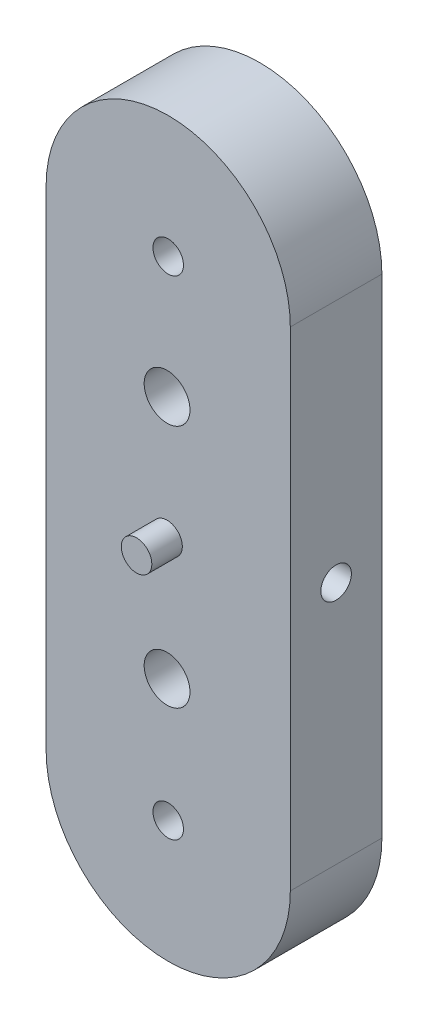
ISO-10303-21;
HEADER;
FILE_DESCRIPTION(('STEP AP214'),'2;1');
FILE_NAME('part.step','',(''),(''),'','','');
FILE_SCHEMA(('AUTOMOTIVE_DESIGN { 1 0 10303 214 1 1 1 1 }'));
ENDSEC;
DATA;
#1=APPLICATION_CONTEXT('core data for automotive mechanical design processes');
#2=APPLICATION_PROTOCOL_DEFINITION('international standard','automotive_design',2000,#1);
#3=PRODUCT_CONTEXT('',#1,'mechanical');
#4=PRODUCT('Part','Part','',(#3));
#5=PRODUCT_RELATED_PRODUCT_CATEGORY('part','',(#4));
#6=PRODUCT_DEFINITION_FORMATION('','',#4);
#7=PRODUCT_DEFINITION_CONTEXT('part definition',#1,'design');
#8=PRODUCT_DEFINITION('design','',#6,#7);
#9=PRODUCT_DEFINITION_SHAPE('','',#8);
#10=(LENGTH_UNIT() NAMED_UNIT(*) SI_UNIT(.MILLI.,.METRE.));
#11=(NAMED_UNIT(*) PLANE_ANGLE_UNIT() SI_UNIT($,.RADIAN.));
#12=(NAMED_UNIT(*) SI_UNIT($,.STERADIAN.) SOLID_ANGLE_UNIT());
#13=UNCERTAINTY_MEASURE_WITH_UNIT(LENGTH_MEASURE(1.E-05),#10,'distance_accuracy_value','');
#14=(GEOMETRIC_REPRESENTATION_CONTEXT(3) GLOBAL_UNCERTAINTY_ASSIGNED_CONTEXT((#13)) GLOBAL_UNIT_ASSIGNED_CONTEXT((#10,
#11,#12)) REPRESENTATION_CONTEXT('',''));
#15=CARTESIAN_POINT('',(0.,0.,0.));
#16=DIRECTION('',(0.,0.,1.));
#17=DIRECTION('',(1.,0.,0.));
#18=AXIS2_PLACEMENT_3D('',#15,#16,#17);
#19=CARTESIAN_POINT('',(50.8,0.,38.1));
#20=DIRECTION('',(0.,0.,-1.));
#21=DIRECTION('',(-1.,0.,0.));
#22=AXIS2_PLACEMENT_3D('',#19,#20,#21);
#23=CYLINDRICAL_SURFACE('',#22,50.8);
#24=CARTESIAN_POINT('',(50.8,0.,0.));
#25=DIRECTION('',(0.,0.,1.));
#26=DIRECTION('',(1.,0.,0.));
#27=AXIS2_PLACEMENT_3D('',#24,#25,#26);
#28=CIRCLE('',#27,50.8);
#29=CARTESIAN_POINT('',(0.,0.,0.));
#30=VERTEX_POINT('',#29);
#31=CARTESIAN_POINT('',(101.6,0.,0.));
#32=VERTEX_POINT('',#31);
#33=EDGE_CURVE('E113',#30,#32,#28,.T.);
#34=ORIENTED_EDGE('',*,*,#33,.T.);
#35=DIRECTION('',(0.,0.,-1.));
#36=VECTOR('',#35,1.);
#37=CARTESIAN_POINT('',(101.6,0.,38.1));
#38=LINE('',#37,#36);
#39=CARTESIAN_POINT('',(101.6,0.,38.1));
#40=VERTEX_POINT('',#39);
#41=EDGE_CURVE('E12',#40,#32,#38,.T.);
#42=ORIENTED_EDGE('',*,*,#41,.F.);
#43=CARTESIAN_POINT('',(50.8,0.,38.1));
#44=DIRECTION('',(0.,0.,1.));
#45=DIRECTION('',(1.,0.,0.));
#46=AXIS2_PLACEMENT_3D('',#43,#44,#45);
#47=CIRCLE('',#46,50.8);
#48=CARTESIAN_POINT('',(0.,0.,38.1));
#49=VERTEX_POINT('',#48);
#50=EDGE_CURVE('E97',#49,#40,#47,.T.);
#51=ORIENTED_EDGE('',*,*,#50,.F.);
#52=DIRECTION('',(0.,0.,-1.));
#53=VECTOR('',#52,1.);
#54=CARTESIAN_POINT('',(0.,0.,38.1));
#55=LINE('',#54,#53);
#56=EDGE_CURVE('E109',#49,#30,#55,.T.);
#57=ORIENTED_EDGE('',*,*,#56,.T.);
#58=EDGE_LOOP('',(#34,#42,#51,#57));
#59=FACE_BOUND('',#58,.T.);
#60=ADVANCED_FACE('F45',(#59),#23,.T.);
#61=CARTESIAN_POINT('',(101.6,203.2,38.1));
#62=DIRECTION('',(-1.,0.,0.));
#63=DIRECTION('',(0.,0.,1.));
#64=AXIS2_PLACEMENT_3D('',#61,#62,#63);
#65=PLANE('',#64);
#66=CARTESIAN_POINT('',(101.6,101.6,19.05));
#67=DIRECTION('',(1.,0.,0.));
#68=DIRECTION('',(0.,0.,-1.));
#69=AXIS2_PLACEMENT_3D('',#66,#67,#68);
#70=CIRCLE('',#69,6.35);
#71=CARTESIAN_POINT('',(101.6,101.6,12.7));
#72=VERTEX_POINT('',#71);
#73=EDGE_CURVE('E174',#72,#72,#70,.T.);
#74=ORIENTED_EDGE('',*,*,#73,.F.);
#75=EDGE_LOOP('',(#74));
#76=FACE_BOUND('',#75,.T.);
#77=DIRECTION('',(0.,1.,0.));
#78=VECTOR('',#77,1.);
#79=CARTESIAN_POINT('',(101.6,203.2,0.));
#80=LINE('',#79,#78);
#81=CARTESIAN_POINT('',(101.6,203.2,0.));
#82=VERTEX_POINT('',#81);
#83=EDGE_CURVE('E102',#32,#82,#80,.T.);
#84=ORIENTED_EDGE('',*,*,#83,.T.);
#85=DIRECTION('',(0.,0.,-1.));
#86=VECTOR('',#85,1.);
#87=CARTESIAN_POINT('',(101.6,203.2,38.1));
#88=LINE('',#87,#86);
#89=CARTESIAN_POINT('',(101.6,203.2,38.1));
#90=VERTEX_POINT('',#89);
#91=EDGE_CURVE('E54',#90,#82,#88,.T.);
#92=ORIENTED_EDGE('',*,*,#91,.F.);
#93=DIRECTION('',(0.,1.,0.));
#94=VECTOR('',#93,1.);
#95=CARTESIAN_POINT('',(101.6,203.2,38.1));
#96=LINE('',#95,#94);
#97=EDGE_CURVE('E92',#40,#90,#96,.T.);
#98=ORIENTED_EDGE('',*,*,#97,.F.);
#99=ORIENTED_EDGE('',*,*,#41,.T.);
#100=EDGE_LOOP('',(#84,#92,#98,#99));
#101=FACE_BOUND('',#100,.T.);
#102=ADVANCED_FACE('F101',(#76,#101),#65,.F.);
#103=CARTESIAN_POINT('',(50.8,203.2,38.1));
#104=DIRECTION('',(0.,0.,-1.));
#105=DIRECTION('',(-1.,0.,0.));
#106=AXIS2_PLACEMENT_3D('',#103,#104,#105);
#107=CYLINDRICAL_SURFACE('',#106,50.8);
#108=CARTESIAN_POINT('',(50.8,203.2,0.));
#109=DIRECTION('',(0.,0.,1.));
#110=DIRECTION('',(-1.,0.,0.));
#111=AXIS2_PLACEMENT_3D('',#108,#109,#110);
#112=CIRCLE('',#111,50.8);
#113=CARTESIAN_POINT('',(0.,203.2,0.));
#114=VERTEX_POINT('',#113);
#115=EDGE_CURVE('E79',#82,#114,#112,.T.);
#116=ORIENTED_EDGE('',*,*,#115,.T.);
#117=DIRECTION('',(0.,0.,-1.));
#118=VECTOR('',#117,1.);
#119=CARTESIAN_POINT('',(0.,203.2,38.1));
#120=LINE('',#119,#118);
#121=CARTESIAN_POINT('',(0.,203.2,38.1));
#122=VERTEX_POINT('',#121);
#123=EDGE_CURVE('E104',#122,#114,#120,.T.);
#124=ORIENTED_EDGE('',*,*,#123,.F.);
#125=CARTESIAN_POINT('',(50.8,203.2,38.1));
#126=DIRECTION('',(0.,0.,1.));
#127=DIRECTION('',(-1.,0.,0.));
#128=AXIS2_PLACEMENT_3D('',#125,#126,#127);
#129=CIRCLE('',#128,50.8);
#130=EDGE_CURVE('E95',#90,#122,#129,.T.);
#131=ORIENTED_EDGE('',*,*,#130,.F.);
#132=ORIENTED_EDGE('',*,*,#91,.T.);
#133=EDGE_LOOP('',(#116,#124,#131,#132));
#134=FACE_BOUND('',#133,.T.);
#135=ADVANCED_FACE('F105',(#134),#107,.T.);
#136=CARTESIAN_POINT('',(0.,0.,38.1));
#137=DIRECTION('',(1.,0.,0.));
#138=DIRECTION('',(0.,1.,0.));
#139=AXIS2_PLACEMENT_3D('',#136,#137,#138);
#140=PLANE('',#139);
#141=CARTESIAN_POINT('',(0.,101.6,19.05));
#142=DIRECTION('',(1.,0.,0.));
#143=DIRECTION('',(0.,0.,-1.));
#144=AXIS2_PLACEMENT_3D('',#141,#142,#143);
#145=CIRCLE('',#144,6.35);
#146=CARTESIAN_POINT('',(0.,101.6,12.7));
#147=VERTEX_POINT('',#146);
#148=EDGE_CURVE('E170',#147,#147,#145,.T.);
#149=ORIENTED_EDGE('',*,*,#148,.T.);
#150=EDGE_LOOP('',(#149));
#151=FACE_BOUND('',#150,.T.);
#152=DIRECTION('',(0.,-1.,0.));
#153=VECTOR('',#152,1.);
#154=CARTESIAN_POINT('',(0.,0.,0.));
#155=LINE('',#154,#153);
#156=EDGE_CURVE('E85',#114,#30,#155,.T.);
#157=ORIENTED_EDGE('',*,*,#156,.T.);
#158=ORIENTED_EDGE('',*,*,#56,.F.);
#159=DIRECTION('',(0.,-1.,0.));
#160=VECTOR('',#159,1.);
#161=CARTESIAN_POINT('',(0.,0.,38.1));
#162=LINE('',#161,#160);
#163=EDGE_CURVE('E62',#122,#49,#162,.T.);
#164=ORIENTED_EDGE('',*,*,#163,.F.);
#165=ORIENTED_EDGE('',*,*,#123,.T.);
#166=EDGE_LOOP('',(#157,#158,#164,#165));
#167=FACE_BOUND('',#166,.T.);
#168=ADVANCED_FACE('F127',(#151,#167),#140,.F.);
#169=CARTESIAN_POINT('',(50.8,0.,38.1));
#170=DIRECTION('',(0.,0.,1.));
#171=DIRECTION('',(1.,0.,0.));
#172=AXIS2_PLACEMENT_3D('',#169,#170,#171);
#173=PLANE('',#172);
#174=CARTESIAN_POINT('',(50.3278473783734,101.6,38.1));
#175=DIRECTION('',(0.,0.,1.));
#176=DIRECTION('',(1.,0.,0.));
#177=AXIS2_PLACEMENT_3D('',#174,#175,#176);
#178=CIRCLE('',#177,6.35);
#179=CARTESIAN_POINT('',(56.6778473783734,101.6,38.1));
#180=VERTEX_POINT('',#179);
#181=EDGE_CURVE('E166',#180,#180,#178,.T.);
#182=ORIENTED_EDGE('',*,*,#181,.F.);
#183=EDGE_LOOP('',(#182));
#184=FACE_BOUND('',#183,.T.);
#185=CARTESIAN_POINT('',(50.3278473783734,152.4,38.1));
#186=DIRECTION('',(0.,0.,1.));
#187=DIRECTION('',(1.,0.,0.));
#188=AXIS2_PLACEMENT_3D('',#185,#186,#187);
#189=CIRCLE('',#188,9.52499999999999);
#190=CARTESIAN_POINT('',(59.8528473783733,152.4,38.1));
#191=VERTEX_POINT('',#190);
#192=EDGE_CURVE('E154',#191,#191,#189,.T.);
#193=ORIENTED_EDGE('',*,*,#192,.F.);
#194=EDGE_LOOP('',(#193));
#195=FACE_BOUND('',#194,.T.);
#196=CARTESIAN_POINT('',(50.3278473783734,50.8,38.1));
#197=DIRECTION('',(0.,0.,1.));
#198=DIRECTION('',(1.,0.,0.));
#199=AXIS2_PLACEMENT_3D('',#196,#197,#198);
#200=CIRCLE('',#199,9.52499999999999);
#201=CARTESIAN_POINT('',(59.8528473783733,50.8,38.1));
#202=VERTEX_POINT('',#201);
#203=EDGE_CURVE('E150',#202,#202,#200,.T.);
#204=ORIENTED_EDGE('',*,*,#203,.F.);
#205=EDGE_LOOP('',(#204));
#206=FACE_BOUND('',#205,.T.);
#207=CARTESIAN_POINT('',(50.8,0.,38.1));
#208=DIRECTION('',(0.,0.,1.));
#209=DIRECTION('',(1.,0.,0.));
#210=AXIS2_PLACEMENT_3D('',#207,#208,#209);
#211=CIRCLE('',#210,6.35);
#212=CARTESIAN_POINT('',(57.15,0.,38.1));
#213=VERTEX_POINT('',#212);
#214=EDGE_CURVE('E143',#213,#213,#211,.T.);
#215=ORIENTED_EDGE('',*,*,#214,.F.);
#216=EDGE_LOOP('',(#215));
#217=FACE_BOUND('',#216,.T.);
#218=CARTESIAN_POINT('',(50.8,203.2,38.1));
#219=DIRECTION('',(0.,0.,1.));
#220=DIRECTION('',(1.,0.,0.));
#221=AXIS2_PLACEMENT_3D('',#218,#219,#220);
#222=CIRCLE('',#221,6.35);
#223=CARTESIAN_POINT('',(57.15,203.2,38.1));
#224=VERTEX_POINT('',#223);
#225=EDGE_CURVE('E138',#224,#224,#222,.T.);
#226=ORIENTED_EDGE('',*,*,#225,.F.);
#227=EDGE_LOOP('',(#226));
#228=FACE_BOUND('',#227,.T.);
#229=ORIENTED_EDGE('',*,*,#50,.T.);
#230=ORIENTED_EDGE('',*,*,#97,.T.);
#231=ORIENTED_EDGE('',*,*,#130,.T.);
#232=ORIENTED_EDGE('',*,*,#163,.T.);
#233=EDGE_LOOP('',(#229,#230,#231,#232));
#234=FACE_BOUND('',#233,.T.);
#235=ADVANCED_FACE('F93',(#184,#195,#206,#217,#228,#234),#173,.T.);
#236=CARTESIAN_POINT('',(50.8,0.,0.));
#237=DIRECTION('',(0.,0.,1.));
#238=DIRECTION('',(1.,0.,0.));
#239=AXIS2_PLACEMENT_3D('',#236,#237,#238);
#240=PLANE('',#239);
#241=CARTESIAN_POINT('',(50.8,0.,0.));
#242=DIRECTION('',(0.,0.,1.));
#243=DIRECTION('',(1.,0.,0.));
#244=AXIS2_PLACEMENT_3D('',#241,#242,#243);
#245=CIRCLE('',#244,6.35);
#246=CARTESIAN_POINT('',(57.15,0.,0.));
#247=VERTEX_POINT('',#246);
#248=EDGE_CURVE('E117',#247,#247,#245,.T.);
#249=ORIENTED_EDGE('',*,*,#248,.T.);
#250=EDGE_LOOP('',(#249));
#251=FACE_BOUND('',#250,.T.);
#252=CARTESIAN_POINT('',(50.8,203.2,0.));
#253=DIRECTION('',(0.,0.,1.));
#254=DIRECTION('',(1.,0.,0.));
#255=AXIS2_PLACEMENT_3D('',#252,#253,#254);
#256=CIRCLE('',#255,6.35);
#257=CARTESIAN_POINT('',(57.15,203.2,0.));
#258=VERTEX_POINT('',#257);
#259=EDGE_CURVE('E134',#258,#258,#256,.T.);
#260=ORIENTED_EDGE('',*,*,#259,.T.);
#261=EDGE_LOOP('',(#260));
#262=FACE_BOUND('',#261,.T.);
#263=ORIENTED_EDGE('',*,*,#33,.F.);
#264=ORIENTED_EDGE('',*,*,#156,.F.);
#265=ORIENTED_EDGE('',*,*,#115,.F.);
#266=ORIENTED_EDGE('',*,*,#83,.F.);
#267=EDGE_LOOP('',(#263,#264,#265,#266));
#268=FACE_BOUND('',#267,.T.);
#269=ADVANCED_FACE('F130',(#251,#262,#268),#240,.F.);
#270=CARTESIAN_POINT('',(50.8,203.2,0.));
#271=DIRECTION('',(0.,0.,1.));
#272=DIRECTION('',(1.,0.,0.));
#273=AXIS2_PLACEMENT_3D('',#270,#271,#272);
#274=CYLINDRICAL_SURFACE('',#273,6.35);
#275=CARTESIAN_POINT('',(57.15,203.2,0.));
#276=CARTESIAN_POINT('',(57.15,203.2,0.396875));
#277=CARTESIAN_POINT('',(57.15,203.2,0.79375));
#278=CARTESIAN_POINT('',(57.15,203.2,1.5875));
#279=CARTESIAN_POINT('',(57.15,203.2,1.984375));
#280=CARTESIAN_POINT('',(57.15,203.2,2.778125));
#281=CARTESIAN_POINT('',(57.15,203.2,3.175));
#282=CARTESIAN_POINT('',(57.15,203.2,3.96875));
#283=CARTESIAN_POINT('',(57.15,203.2,4.365625));
#284=CARTESIAN_POINT('',(57.15,203.2,5.159375));
#285=CARTESIAN_POINT('',(57.15,203.2,5.55625));
#286=CARTESIAN_POINT('',(57.15,203.2,6.35));
#287=CARTESIAN_POINT('',(57.15,203.2,6.746875));
#288=CARTESIAN_POINT('',(57.15,203.2,7.540625));
#289=CARTESIAN_POINT('',(57.15,203.2,7.9375));
#290=CARTESIAN_POINT('',(57.15,203.2,8.73125));
#291=CARTESIAN_POINT('',(57.15,203.2,9.128125));
#292=CARTESIAN_POINT('',(57.15,203.2,9.921875));
#293=CARTESIAN_POINT('',(57.15,203.2,10.31875));
#294=CARTESIAN_POINT('',(57.15,203.2,11.1125));
#295=CARTESIAN_POINT('',(57.15,203.2,11.509375));
#296=CARTESIAN_POINT('',(57.15,203.2,12.303125));
#297=CARTESIAN_POINT('',(57.15,203.2,12.7));
#298=CARTESIAN_POINT('',(57.15,203.2,13.49375));
#299=CARTESIAN_POINT('',(57.15,203.2,13.890625));
#300=CARTESIAN_POINT('',(57.15,203.2,14.684375));
#301=CARTESIAN_POINT('',(57.15,203.2,15.08125));
#302=CARTESIAN_POINT('',(57.15,203.2,15.875));
#303=CARTESIAN_POINT('',(57.15,203.2,16.271875));
#304=CARTESIAN_POINT('',(57.15,203.2,17.065625));
#305=CARTESIAN_POINT('',(57.15,203.2,17.4625));
#306=CARTESIAN_POINT('',(57.15,203.2,18.25625));
#307=CARTESIAN_POINT('',(57.15,203.2,18.653125));
#308=CARTESIAN_POINT('',(57.15,203.2,19.446875));
#309=CARTESIAN_POINT('',(57.15,203.2,19.84375));
#310=CARTESIAN_POINT('',(57.15,203.2,20.6375));
#311=CARTESIAN_POINT('',(57.15,203.2,21.034375));
#312=CARTESIAN_POINT('',(57.15,203.2,21.828125));
#313=CARTESIAN_POINT('',(57.15,203.2,22.225));
#314=CARTESIAN_POINT('',(57.15,203.2,23.01875));
#315=CARTESIAN_POINT('',(57.15,203.2,23.415625));
#316=CARTESIAN_POINT('',(57.15,203.2,24.209375));
#317=CARTESIAN_POINT('',(57.15,203.2,24.60625));
#318=CARTESIAN_POINT('',(57.15,203.2,25.4));
#319=CARTESIAN_POINT('',(57.15,203.2,25.796875));
#320=CARTESIAN_POINT('',(57.15,203.2,26.590625));
#321=CARTESIAN_POINT('',(57.15,203.2,26.9875));
#322=CARTESIAN_POINT('',(57.15,203.2,27.78125));
#323=CARTESIAN_POINT('',(57.15,203.2,28.178125));
#324=CARTESIAN_POINT('',(57.15,203.2,28.971875));
#325=CARTESIAN_POINT('',(57.15,203.2,29.36875));
#326=CARTESIAN_POINT('',(57.15,203.2,30.1625));
#327=CARTESIAN_POINT('',(57.15,203.2,30.559375));
#328=CARTESIAN_POINT('',(57.15,203.2,31.353125));
#329=CARTESIAN_POINT('',(57.15,203.2,31.75));
#330=CARTESIAN_POINT('',(57.15,203.2,32.54375));
#331=CARTESIAN_POINT('',(57.15,203.2,32.940625));
#332=CARTESIAN_POINT('',(57.15,203.2,33.734375));
#333=CARTESIAN_POINT('',(57.15,203.2,34.13125));
#334=CARTESIAN_POINT('',(57.15,203.2,34.925));
#335=CARTESIAN_POINT('',(57.15,203.2,35.321875));
#336=CARTESIAN_POINT('',(57.15,203.2,36.115625));
#337=CARTESIAN_POINT('',(57.15,203.2,36.5125));
#338=CARTESIAN_POINT('',(57.15,203.2,37.30625));
#339=CARTESIAN_POINT('',(57.15,203.2,37.703125));
#340=CARTESIAN_POINT('',(57.15,203.2,38.1));
#341=B_SPLINE_CURVE_WITH_KNOTS('',3,(#275,#276,#277,#278,#279,#280,#281,#282,#283,#284,#285,
#286,#287,#288,#289,#290,#291,#292,#293,#294,#295,#296,#297,#298,#299,#300,#301,#302,#303,#304,
#305,#306,#307,#308,#309,#310,#311,#312,#313,#314,#315,#316,#317,#318,#319,#320,#321,#322,#323,
#324,#325,#326,#327,#328,#329,#330,#331,#332,#333,#334,#335,#336,#337,#338,#339,#340),
.UNSPECIFIED.,.F.,.F.,(4,2,2,2,2,2,2,2,2,2,2,2,2,2,2,2,2,2,2,2,2,2,2,2,2,2,2,2,2,2,2,2,4),(0.,
1.190625,2.38125,3.571875,4.7625,5.953125,7.14375,8.334375,9.525,10.715625,11.90625,13.096875,
14.2875,15.478125,16.66875,17.859375,19.05,20.240625,21.43125,22.621875,23.8125,25.003125,
26.19375,27.384375,28.575,29.765625,30.95625,32.146875,33.3375,34.528125,35.71875,36.909375,
38.1),.UNSPECIFIED.);
#342=EDGE_CURVE('BSEAM201',#258,#224,#341,.T.);
#343=ORIENTED_EDGE('',*,*,#259,.F.);
#344=ORIENTED_EDGE('',*,*,#225,.T.);
#345=ORIENTED_EDGE('',*,*,#342,.T.);
#346=ORIENTED_EDGE('',*,*,#342,.F.);
#347=EDGE_LOOP('',(#343,#345,#344,#346));
#348=FACE_BOUND('',#347,.T.);
#349=ADVANCED_FACE('F201',(#348),#274,.F.);
#350=CARTESIAN_POINT('',(50.8,0.,0.));
#351=DIRECTION('',(0.,0.,1.));
#352=DIRECTION('',(1.,0.,0.));
#353=AXIS2_PLACEMENT_3D('',#350,#351,#352);
#354=CYLINDRICAL_SURFACE('',#353,6.35);
#355=CARTESIAN_POINT('',(57.15,0.,0.));
#356=CARTESIAN_POINT('',(57.15,0.,0.396875));
#357=CARTESIAN_POINT('',(57.15,0.,0.79375));
#358=CARTESIAN_POINT('',(57.15,0.,1.5875));
#359=CARTESIAN_POINT('',(57.15,0.,1.984375));
#360=CARTESIAN_POINT('',(57.15,0.,2.778125));
#361=CARTESIAN_POINT('',(57.15,0.,3.175));
#362=CARTESIAN_POINT('',(57.15,0.,3.96875));
#363=CARTESIAN_POINT('',(57.15,0.,4.365625));
#364=CARTESIAN_POINT('',(57.15,0.,5.159375));
#365=CARTESIAN_POINT('',(57.15,0.,5.55625));
#366=CARTESIAN_POINT('',(57.15,0.,6.35));
#367=CARTESIAN_POINT('',(57.15,0.,6.746875));
#368=CARTESIAN_POINT('',(57.15,0.,7.540625));
#369=CARTESIAN_POINT('',(57.15,0.,7.9375));
#370=CARTESIAN_POINT('',(57.15,0.,8.73125));
#371=CARTESIAN_POINT('',(57.15,0.,9.128125));
#372=CARTESIAN_POINT('',(57.15,0.,9.921875));
#373=CARTESIAN_POINT('',(57.15,0.,10.31875));
#374=CARTESIAN_POINT('',(57.15,0.,11.1125));
#375=CARTESIAN_POINT('',(57.15,0.,11.509375));
#376=CARTESIAN_POINT('',(57.15,0.,12.303125));
#377=CARTESIAN_POINT('',(57.15,0.,12.7));
#378=CARTESIAN_POINT('',(57.15,0.,13.49375));
#379=CARTESIAN_POINT('',(57.15,0.,13.890625));
#380=CARTESIAN_POINT('',(57.15,0.,14.684375));
#381=CARTESIAN_POINT('',(57.15,0.,15.08125));
#382=CARTESIAN_POINT('',(57.15,0.,15.875));
#383=CARTESIAN_POINT('',(57.15,0.,16.271875));
#384=CARTESIAN_POINT('',(57.15,0.,17.065625));
#385=CARTESIAN_POINT('',(57.15,0.,17.4625));
#386=CARTESIAN_POINT('',(57.15,0.,18.25625));
#387=CARTESIAN_POINT('',(57.15,0.,18.653125));
#388=CARTESIAN_POINT('',(57.15,0.,19.446875));
#389=CARTESIAN_POINT('',(57.15,0.,19.84375));
#390=CARTESIAN_POINT('',(57.15,0.,20.6375));
#391=CARTESIAN_POINT('',(57.15,0.,21.034375));
#392=CARTESIAN_POINT('',(57.15,0.,21.828125));
#393=CARTESIAN_POINT('',(57.15,0.,22.225));
#394=CARTESIAN_POINT('',(57.15,0.,23.01875));
#395=CARTESIAN_POINT('',(57.15,0.,23.415625));
#396=CARTESIAN_POINT('',(57.15,0.,24.209375));
#397=CARTESIAN_POINT('',(57.15,0.,24.60625));
#398=CARTESIAN_POINT('',(57.15,0.,25.4));
#399=CARTESIAN_POINT('',(57.15,0.,25.796875));
#400=CARTESIAN_POINT('',(57.15,0.,26.590625));
#401=CARTESIAN_POINT('',(57.15,0.,26.9875));
#402=CARTESIAN_POINT('',(57.15,0.,27.78125));
#403=CARTESIAN_POINT('',(57.15,0.,28.178125));
#404=CARTESIAN_POINT('',(57.15,0.,28.971875));
#405=CARTESIAN_POINT('',(57.15,0.,29.36875));
#406=CARTESIAN_POINT('',(57.15,0.,30.1625));
#407=CARTESIAN_POINT('',(57.15,0.,30.559375));
#408=CARTESIAN_POINT('',(57.15,0.,31.353125));
#409=CARTESIAN_POINT('',(57.15,0.,31.75));
#410=CARTESIAN_POINT('',(57.15,0.,32.54375));
#411=CARTESIAN_POINT('',(57.15,0.,32.940625));
#412=CARTESIAN_POINT('',(57.15,0.,33.734375));
#413=CARTESIAN_POINT('',(57.15,0.,34.13125));
#414=CARTESIAN_POINT('',(57.15,0.,34.925));
#415=CARTESIAN_POINT('',(57.15,0.,35.321875));
#416=CARTESIAN_POINT('',(57.15,0.,36.115625));
#417=CARTESIAN_POINT('',(57.15,0.,36.5125));
#418=CARTESIAN_POINT('',(57.15,0.,37.30625));
#419=CARTESIAN_POINT('',(57.15,0.,37.703125));
#420=CARTESIAN_POINT('',(57.15,0.,38.1));
#421=B_SPLINE_CURVE_WITH_KNOTS('',3,(#355,#356,#357,#358,#359,#360,#361,#362,#363,#364,#365,
#366,#367,#368,#369,#370,#371,#372,#373,#374,#375,#376,#377,#378,#379,#380,#381,#382,#383,#384,
#385,#386,#387,#388,#389,#390,#391,#392,#393,#394,#395,#396,#397,#398,#399,#400,#401,#402,#403,
#404,#405,#406,#407,#408,#409,#410,#411,#412,#413,#414,#415,#416,#417,#418,#419,#420),
.UNSPECIFIED.,.F.,.F.,(4,2,2,2,2,2,2,2,2,2,2,2,2,2,2,2,2,2,2,2,2,2,2,2,2,2,2,2,2,2,2,2,4),(0.,
1.190625,2.38125,3.571875,4.7625,5.953125,7.14375,8.334375,9.525,10.715625,11.90625,13.096875,
14.2875,15.478125,16.66875,17.859375,19.05,20.240625,21.43125,22.621875,23.8125,25.003125,
26.19375,27.384375,28.575,29.765625,30.95625,32.146875,33.3375,34.528125,35.71875,36.909375,
38.1),.UNSPECIFIED.);
#422=EDGE_CURVE('BSEAM208',#247,#213,#421,.T.);
#423=ORIENTED_EDGE('',*,*,#248,.F.);
#424=ORIENTED_EDGE('',*,*,#214,.T.);
#425=ORIENTED_EDGE('',*,*,#422,.T.);
#426=ORIENTED_EDGE('',*,*,#422,.F.);
#427=EDGE_LOOP('',(#423,#425,#424,#426));
#428=FACE_BOUND('',#427,.T.);
#429=ADVANCED_FACE('F208',(#428),#354,.F.);
#430=CARTESIAN_POINT('',(50.3278473783734,50.8,-26.9407683632075));
#431=DIRECTION('',(0.,0.,1.));
#432=DIRECTION('',(1.,0.,0.));
#433=AXIS2_PLACEMENT_3D('',#430,#431,#432);
#434=CYLINDRICAL_SURFACE('',#433,9.52499999999999);
#435=CARTESIAN_POINT('',(50.3278473783734,50.8,2.54));
#436=DIRECTION('',(0.,0.,1.));
#437=DIRECTION('',(1.,0.,0.));
#438=AXIS2_PLACEMENT_3D('',#435,#436,#437);
#439=CIRCLE('',#438,9.52499999999999);
#440=CARTESIAN_POINT('',(59.8528473783733,50.8,2.54));
#441=VERTEX_POINT('',#440);
#442=EDGE_CURVE('E155',#441,#441,#439,.F.);
#443=ORIENTED_EDGE('',*,*,#442,.T.);
#444=EDGE_LOOP('',(#443));
#445=FACE_BOUND('',#444,.T.);
#446=ORIENTED_EDGE('',*,*,#203,.T.);
#447=EDGE_LOOP('',(#446));
#448=FACE_BOUND('',#447,.T.);
#449=ADVANCED_FACE('F212',(#445,#448),#434,.F.);
#450=CARTESIAN_POINT('',(50.8,0.,2.54));
#451=DIRECTION('',(0.,0.,1.));
#452=DIRECTION('',(1.,0.,0.));
#453=AXIS2_PLACEMENT_3D('',#450,#451,#452);
#454=PLANE('',#453);
#455=ORIENTED_EDGE('',*,*,#442,.F.);
#456=EDGE_LOOP('',(#455));
#457=FACE_BOUND('',#456,.T.);
#458=ADVANCED_FACE('F214',(#457),#454,.T.);
#459=CARTESIAN_POINT('',(50.3278473783734,152.4,-26.9407683632075));
#460=DIRECTION('',(0.,0.,1.));
#461=DIRECTION('',(1.,0.,0.));
#462=AXIS2_PLACEMENT_3D('',#459,#460,#461);
#463=CYLINDRICAL_SURFACE('',#462,9.52499999999999);
#464=CARTESIAN_POINT('',(50.3278473783734,152.4,2.54));
#465=DIRECTION('',(0.,0.,1.));
#466=DIRECTION('',(1.,0.,0.));
#467=AXIS2_PLACEMENT_3D('',#464,#465,#466);
#468=CIRCLE('',#467,9.52499999999999);
#469=CARTESIAN_POINT('',(59.8528473783733,152.4,2.54));
#470=VERTEX_POINT('',#469);
#471=EDGE_CURVE('E139',#470,#470,#468,.F.);
#472=ORIENTED_EDGE('',*,*,#471,.T.);
#473=EDGE_LOOP('',(#472));
#474=FACE_BOUND('',#473,.T.);
#475=ORIENTED_EDGE('',*,*,#192,.T.);
#476=EDGE_LOOP('',(#475));
#477=FACE_BOUND('',#476,.T.);
#478=ADVANCED_FACE('F217',(#474,#477),#463,.F.);
#479=CARTESIAN_POINT('',(50.8,0.,2.54));
#480=DIRECTION('',(0.,0.,1.));
#481=DIRECTION('',(1.,0.,0.));
#482=AXIS2_PLACEMENT_3D('',#479,#480,#481);
#483=PLANE('',#482);
#484=ORIENTED_EDGE('',*,*,#471,.F.);
#485=EDGE_LOOP('',(#484));
#486=FACE_BOUND('',#485,.T.);
#487=ADVANCED_FACE('F224',(#486),#483,.T.);
#488=CARTESIAN_POINT('',(50.3278473783734,101.6,50.8));
#489=DIRECTION('',(0.,0.,-1.));
#490=DIRECTION('',(-1.,0.,0.));
#491=AXIS2_PLACEMENT_3D('',#488,#489,#490);
#492=CYLINDRICAL_SURFACE('',#491,6.35);
#493=CARTESIAN_POINT('',(50.3278473783734,101.6,50.8));
#494=DIRECTION('',(0.,0.,1.));
#495=DIRECTION('',(1.,0.,0.));
#496=AXIS2_PLACEMENT_3D('',#493,#494,#495);
#497=CIRCLE('',#496,6.35);
#498=CARTESIAN_POINT('',(56.6778473783734,101.6,50.8));
#499=VERTEX_POINT('',#498);
#500=EDGE_CURVE('E159',#499,#499,#497,.T.);
#501=ORIENTED_EDGE('',*,*,#500,.F.);
#502=EDGE_LOOP('',(#501));
#503=FACE_BOUND('',#502,.T.);
#504=ORIENTED_EDGE('',*,*,#181,.T.);
#505=EDGE_LOOP('',(#504));
#506=FACE_BOUND('',#505,.T.);
#507=ADVANCED_FACE('F228',(#503,#506),#492,.T.);
#508=CARTESIAN_POINT('',(50.3278473783734,101.6,50.8));
#509=DIRECTION('',(0.,0.,1.));
#510=DIRECTION('',(1.,0.,0.));
#511=AXIS2_PLACEMENT_3D('',#508,#509,#510);
#512=PLANE('',#511);
#513=ORIENTED_EDGE('',*,*,#500,.T.);
#514=EDGE_LOOP('',(#513));
#515=FACE_BOUND('',#514,.T.);
#516=ADVANCED_FACE('F186',(#515),#512,.T.);
#517=CARTESIAN_POINT('',(0.,101.6,19.05));
#518=DIRECTION('',(1.,0.,0.));
#519=DIRECTION('',(0.,0.,-1.));
#520=AXIS2_PLACEMENT_3D('',#517,#518,#519);
#521=CYLINDRICAL_SURFACE('',#520,6.35);
#522=ORIENTED_EDGE('',*,*,#148,.F.);
#523=EDGE_LOOP('',(#522));
#524=FACE_BOUND('',#523,.T.);
#525=ORIENTED_EDGE('',*,*,#73,.T.);
#526=EDGE_LOOP('',(#525));
#527=FACE_BOUND('',#526,.T.);
#528=ADVANCED_FACE('F183',(#524,#527),#521,.F.);
#529=CLOSED_SHELL('',(#60,#102,#135,#168,#235,#269,#349,#429,#449,#458,#478,#487,#507,#516,#528));
#530=MANIFOLD_SOLID_BREP('B2',#529);
#531=ADVANCED_BREP_SHAPE_REPRESENTATION('',(#18,#530),#14);
#532=SHAPE_DEFINITION_REPRESENTATION(#9,#531);
ENDSEC;
END-ISO-10303-21;
